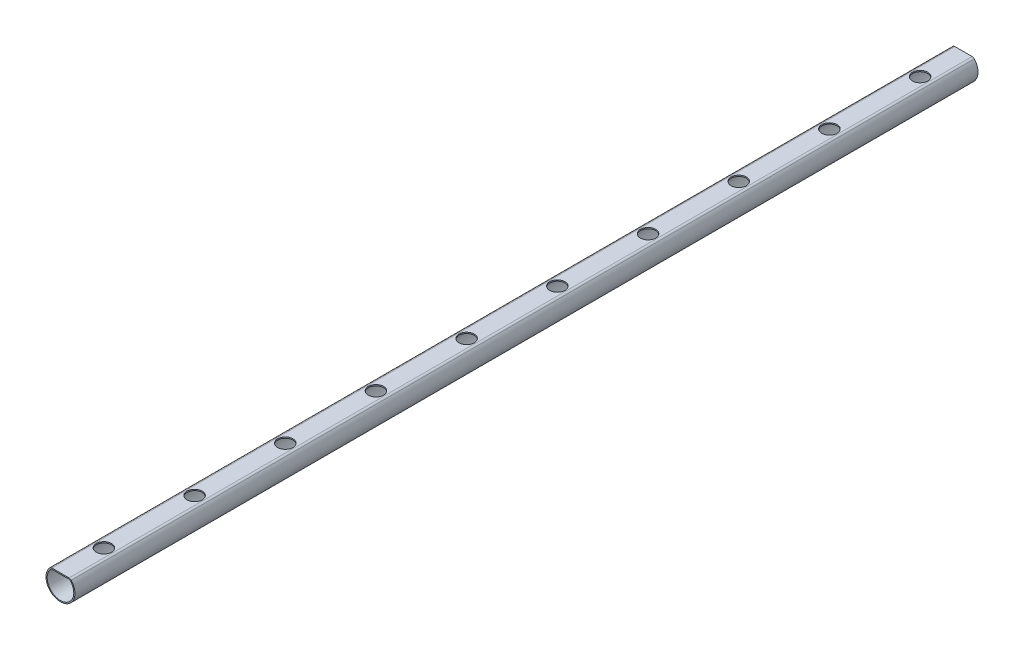
ISO-10303-21;
HEADER;
FILE_DESCRIPTION(('STEP AP214'),'2;1');
FILE_NAME('part.step','',(''),(''),'','','');
FILE_SCHEMA(('AUTOMOTIVE_DESIGN { 1 0 10303 214 1 1 1 1 }'));
ENDSEC;
DATA;
#1=APPLICATION_CONTEXT('core data for automotive mechanical design processes');
#2=APPLICATION_PROTOCOL_DEFINITION('international standard','automotive_design',2000,#1);
#3=PRODUCT_CONTEXT('',#1,'mechanical');
#4=PRODUCT('Part','Part','',(#3));
#5=PRODUCT_RELATED_PRODUCT_CATEGORY('part','',(#4));
#6=PRODUCT_DEFINITION_FORMATION('','',#4);
#7=PRODUCT_DEFINITION_CONTEXT('part definition',#1,'design');
#8=PRODUCT_DEFINITION('design','',#6,#7);
#9=PRODUCT_DEFINITION_SHAPE('','',#8);
#10=(LENGTH_UNIT() NAMED_UNIT(*) SI_UNIT(.MILLI.,.METRE.));
#11=(NAMED_UNIT(*) PLANE_ANGLE_UNIT() SI_UNIT($,.RADIAN.));
#12=(NAMED_UNIT(*) SI_UNIT($,.STERADIAN.) SOLID_ANGLE_UNIT());
#13=UNCERTAINTY_MEASURE_WITH_UNIT(LENGTH_MEASURE(1.E-05),#10,'distance_accuracy_value','');
#14=(GEOMETRIC_REPRESENTATION_CONTEXT(3) GLOBAL_UNCERTAINTY_ASSIGNED_CONTEXT((#13)) GLOBAL_UNIT_ASSIGNED_CONTEXT((#10,
#11,#12)) REPRESENTATION_CONTEXT('',''));
#15=CARTESIAN_POINT('',(0.,0.,0.));
#16=DIRECTION('',(0.,0.,1.));
#17=DIRECTION('',(1.,0.,0.));
#18=AXIS2_PLACEMENT_3D('',#15,#16,#17);
#19=CARTESIAN_POINT('',(-8.94427190999916,7.99999999999999,936.));
#20=DIRECTION('',(0.,0.,-1.));
#21=DIRECTION('',(-1.,0.,0.));
#22=AXIS2_PLACEMENT_3D('',#19,#20,#21);
#23=PLANE('',#22);
#24=CARTESIAN_POINT('',(-8.94427190999916,7.99999999999999,936.));
#25=DIRECTION('',(0.,0.,1.));
#26=DIRECTION('',(-1.,0.,0.));
#27=AXIS2_PLACEMENT_3D('',#24,#25,#26);
#28=CIRCLE('',#27,3.);
#29=CARTESIAN_POINT('',(-8.94427190999916,11.,936.));
#30=VERTEX_POINT('',#29);
#31=CARTESIAN_POINT('',(-11.180339887499,9.99999999999999,936.));
#32=VERTEX_POINT('',#31);
#33=EDGE_CURVE('E140',#30,#32,#28,.T.);
#34=ORIENTED_EDGE('',*,*,#33,.T.);
#35=CARTESIAN_POINT('',(0.,0.,936.));
#36=DIRECTION('',(0.,0.,1.));
#37=DIRECTION('',(1.,0.,0.));
#38=AXIS2_PLACEMENT_3D('',#35,#36,#37);
#39=CIRCLE('',#38,15.);
#40=CARTESIAN_POINT('',(11.1803398874989,10.,936.));
#41=VERTEX_POINT('',#40);
#42=EDGE_CURVE('E143',#32,#41,#39,.T.);
#43=ORIENTED_EDGE('',*,*,#42,.T.);
#44=CARTESIAN_POINT('',(8.94427190999916,8.,936.));
#45=DIRECTION('',(0.,0.,1.));
#46=DIRECTION('',(-1.,0.,0.));
#47=AXIS2_PLACEMENT_3D('',#44,#45,#46);
#48=CIRCLE('',#47,3.);
#49=CARTESIAN_POINT('',(8.94427190999916,11.,936.));
#50=VERTEX_POINT('',#49);
#51=EDGE_CURVE('E146',#41,#50,#48,.T.);
#52=ORIENTED_EDGE('',*,*,#51,.T.);
#53=DIRECTION('',(-1.,0.,0.));
#54=VECTOR('',#53,1.);
#55=CARTESIAN_POINT('',(8.94427190999916,11.,936.));
#56=LINE('',#55,#54);
#57=EDGE_CURVE('E148',#50,#30,#56,.T.);
#58=ORIENTED_EDGE('',*,*,#57,.T.);
#59=EDGE_LOOP('',(#34,#43,#52,#58));
#60=FACE_BOUND('',#59,.T.);
#61=CARTESIAN_POINT('',(-8.94427190999916,7.99999999999999,936.));
#62=DIRECTION('',(0.,0.,1.));
#63=DIRECTION('',(-1.,0.,0.));
#64=AXIS2_PLACEMENT_3D('',#61,#62,#63);
#65=CIRCLE('',#64,1.80000000000001);
#66=CARTESIAN_POINT('',(-8.94427190999916,9.8,936.));
#67=VERTEX_POINT('',#66);
#68=CARTESIAN_POINT('',(-10.285912696499,9.19999999999999,936.));
#69=VERTEX_POINT('',#68);
#70=EDGE_CURVE('E102',#67,#69,#65,.T.);
#71=ORIENTED_EDGE('',*,*,#70,.F.);
#72=DIRECTION('',(-1.,0.,0.));
#73=VECTOR('',#72,1.);
#74=CARTESIAN_POINT('',(8.94427190999916,9.8,936.));
#75=LINE('',#74,#73);
#76=CARTESIAN_POINT('',(8.94427190999916,9.8,936.));
#77=VERTEX_POINT('',#76);
#78=EDGE_CURVE('E124',#77,#67,#75,.T.);
#79=ORIENTED_EDGE('',*,*,#78,.F.);
#80=CARTESIAN_POINT('',(8.94427190999916,8.,936.));
#81=DIRECTION('',(0.,0.,1.));
#82=DIRECTION('',(-1.,0.,0.));
#83=AXIS2_PLACEMENT_3D('',#80,#81,#82);
#84=CIRCLE('',#83,1.8);
#85=CARTESIAN_POINT('',(10.285912696499,9.2,936.));
#86=VERTEX_POINT('',#85);
#87=EDGE_CURVE('E122',#86,#77,#84,.T.);
#88=ORIENTED_EDGE('',*,*,#87,.F.);
#89=CARTESIAN_POINT('',(0.,0.,936.));
#90=DIRECTION('',(0.,0.,1.));
#91=DIRECTION('',(1.,0.,0.));
#92=AXIS2_PLACEMENT_3D('',#89,#90,#91);
#93=CIRCLE('',#92,13.8);
#94=EDGE_CURVE('E110',#69,#86,#93,.T.);
#95=ORIENTED_EDGE('',*,*,#94,.F.);
#96=EDGE_LOOP('',(#71,#79,#88,#95));
#97=FACE_BOUND('',#96,.T.);
#98=ADVANCED_FACE('F37',(#60,#97),#23,.F.);
#99=CARTESIAN_POINT('',(-8.94427190999916,7.99999999999999,0.));
#100=DIRECTION('',(0.,0.,-1.));
#101=DIRECTION('',(-1.,0.,0.));
#102=AXIS2_PLACEMENT_3D('',#99,#100,#101);
#103=PLANE('',#102);
#104=CARTESIAN_POINT('',(-8.94427190999916,7.99999999999999,0.));
#105=DIRECTION('',(0.,0.,1.));
#106=DIRECTION('',(-1.,0.,0.));
#107=AXIS2_PLACEMENT_3D('',#104,#105,#106);
#108=CIRCLE('',#107,3.);
#109=CARTESIAN_POINT('',(-8.94427190999916,11.,0.));
#110=VERTEX_POINT('',#109);
#111=CARTESIAN_POINT('',(-11.180339887499,9.99999999999999,0.));
#112=VERTEX_POINT('',#111);
#113=EDGE_CURVE('E118',#110,#112,#108,.T.);
#114=ORIENTED_EDGE('',*,*,#113,.F.);
#115=DIRECTION('',(-1.,0.,0.));
#116=VECTOR('',#115,1.);
#117=CARTESIAN_POINT('',(8.94427190999916,11.,0.));
#118=LINE('',#117,#116);
#119=CARTESIAN_POINT('',(8.94427190999916,11.,0.));
#120=VERTEX_POINT('',#119);
#121=EDGE_CURVE('E144',#120,#110,#118,.T.);
#122=ORIENTED_EDGE('',*,*,#121,.F.);
#123=CARTESIAN_POINT('',(8.94427190999916,8.,0.));
#124=DIRECTION('',(0.,0.,1.));
#125=DIRECTION('',(-1.,0.,0.));
#126=AXIS2_PLACEMENT_3D('',#123,#124,#125);
#127=CIRCLE('',#126,3.);
#128=CARTESIAN_POINT('',(11.1803398874989,10.,0.));
#129=VERTEX_POINT('',#128);
#130=EDGE_CURVE('E155',#129,#120,#127,.T.);
#131=ORIENTED_EDGE('',*,*,#130,.F.);
#132=CARTESIAN_POINT('',(0.,0.,0.));
#133=DIRECTION('',(0.,0.,1.));
#134=DIRECTION('',(1.,0.,0.));
#135=AXIS2_PLACEMENT_3D('',#132,#133,#134);
#136=CIRCLE('',#135,15.);
#137=EDGE_CURVE('E153',#112,#129,#136,.T.);
#138=ORIENTED_EDGE('',*,*,#137,.F.);
#139=EDGE_LOOP('',(#114,#122,#131,#138));
#140=FACE_BOUND('',#139,.T.);
#141=DIRECTION('',(-1.,0.,0.));
#142=VECTOR('',#141,1.);
#143=CARTESIAN_POINT('',(8.94427190999916,9.8,0.));
#144=LINE('',#143,#142);
#145=CARTESIAN_POINT('',(8.94427190999916,9.8,0.));
#146=VERTEX_POINT('',#145);
#147=CARTESIAN_POINT('',(-8.94427190999916,9.8,0.));
#148=VERTEX_POINT('',#147);
#149=EDGE_CURVE('E111',#146,#148,#144,.T.);
#150=ORIENTED_EDGE('',*,*,#149,.T.);
#151=CARTESIAN_POINT('',(-8.94427190999916,7.99999999999999,0.));
#152=DIRECTION('',(0.,0.,1.));
#153=DIRECTION('',(-1.,0.,0.));
#154=AXIS2_PLACEMENT_3D('',#151,#152,#153);
#155=CIRCLE('',#154,1.80000000000001);
#156=CARTESIAN_POINT('',(-10.285912696499,9.19999999999999,0.));
#157=VERTEX_POINT('',#156);
#158=EDGE_CURVE('E60',#148,#157,#155,.T.);
#159=ORIENTED_EDGE('',*,*,#158,.T.);
#160=CARTESIAN_POINT('',(0.,0.,0.));
#161=DIRECTION('',(0.,0.,1.));
#162=DIRECTION('',(1.,0.,0.));
#163=AXIS2_PLACEMENT_3D('',#160,#161,#162);
#164=CIRCLE('',#163,13.8);
#165=CARTESIAN_POINT('',(10.285912696499,9.2,0.));
#166=VERTEX_POINT('',#165);
#167=EDGE_CURVE('E117',#157,#166,#164,.T.);
#168=ORIENTED_EDGE('',*,*,#167,.T.);
#169=CARTESIAN_POINT('',(8.94427190999916,8.,0.));
#170=DIRECTION('',(0.,0.,1.));
#171=DIRECTION('',(-1.,0.,0.));
#172=AXIS2_PLACEMENT_3D('',#169,#170,#171);
#173=CIRCLE('',#172,1.8);
#174=EDGE_CURVE('E132',#166,#146,#173,.T.);
#175=ORIENTED_EDGE('',*,*,#174,.T.);
#176=EDGE_LOOP('',(#150,#159,#168,#175));
#177=FACE_BOUND('',#176,.T.);
#178=ADVANCED_FACE('F173',(#140,#177),#103,.T.);
#179=CARTESIAN_POINT('',(-8.94427190999916,7.99999999999999,936.));
#180=DIRECTION('',(0.,0.,-1.));
#181=DIRECTION('',(-1.,0.,0.));
#182=AXIS2_PLACEMENT_3D('',#179,#180,#181);
#183=CYLINDRICAL_SURFACE('',#182,3.);
#184=ORIENTED_EDGE('',*,*,#113,.T.);
#185=DIRECTION('',(0.,0.,-1.));
#186=VECTOR('',#185,1.);
#187=CARTESIAN_POINT('',(-11.180339887499,9.99999999999999,936.));
#188=LINE('',#187,#186);
#189=EDGE_CURVE('E11',#32,#112,#188,.T.);
#190=ORIENTED_EDGE('',*,*,#189,.F.);
#191=ORIENTED_EDGE('',*,*,#33,.F.);
#192=DIRECTION('',(0.,0.,-1.));
#193=VECTOR('',#192,1.);
#194=CARTESIAN_POINT('',(-8.94427190999916,11.,936.));
#195=LINE('',#194,#193);
#196=EDGE_CURVE('E150',#30,#110,#195,.T.);
#197=ORIENTED_EDGE('',*,*,#196,.T.);
#198=EDGE_LOOP('',(#184,#190,#191,#197));
#199=FACE_BOUND('',#198,.T.);
#200=ADVANCED_FACE('F39',(#199),#183,.T.);
#201=CARTESIAN_POINT('',(0.,0.,936.));
#202=DIRECTION('',(0.,0.,-1.));
#203=DIRECTION('',(-1.,0.,0.));
#204=AXIS2_PLACEMENT_3D('',#201,#202,#203);
#205=CYLINDRICAL_SURFACE('',#204,15.);
#206=ORIENTED_EDGE('',*,*,#137,.T.);
#207=DIRECTION('',(0.,0.,-1.));
#208=VECTOR('',#207,1.);
#209=CARTESIAN_POINT('',(11.1803398874989,10.,936.));
#210=LINE('',#209,#208);
#211=EDGE_CURVE('E45',#41,#129,#210,.T.);
#212=ORIENTED_EDGE('',*,*,#211,.F.);
#213=ORIENTED_EDGE('',*,*,#42,.F.);
#214=ORIENTED_EDGE('',*,*,#189,.T.);
#215=EDGE_LOOP('',(#206,#212,#213,#214));
#216=FACE_BOUND('',#215,.T.);
#217=ADVANCED_FACE('F183',(#216),#205,.T.);
#218=CARTESIAN_POINT('',(8.94427190999916,8.,936.));
#219=DIRECTION('',(0.,0.,-1.));
#220=DIRECTION('',(-1.,0.,0.));
#221=AXIS2_PLACEMENT_3D('',#218,#219,#220);
#222=CYLINDRICAL_SURFACE('',#221,3.);
#223=ORIENTED_EDGE('',*,*,#130,.T.);
#224=DIRECTION('',(0.,0.,-1.));
#225=VECTOR('',#224,1.);
#226=CARTESIAN_POINT('',(8.94427190999916,11.,936.));
#227=LINE('',#226,#225);
#228=EDGE_CURVE('E160',#50,#120,#227,.T.);
#229=ORIENTED_EDGE('',*,*,#228,.F.);
#230=ORIENTED_EDGE('',*,*,#51,.F.);
#231=ORIENTED_EDGE('',*,*,#211,.T.);
#232=EDGE_LOOP('',(#223,#229,#230,#231));
#233=FACE_BOUND('',#232,.T.);
#234=ADVANCED_FACE('F167',(#233),#222,.T.);
#235=CARTESIAN_POINT('',(8.94427190999916,11.,936.));
#236=DIRECTION('',(0.,-1.,0.));
#237=DIRECTION('',(1.,0.,0.));
#238=AXIS2_PLACEMENT_3D('',#235,#236,#237);
#239=PLANE('',#238);
#240=CARTESIAN_POINT('',(-2.84894403843315E-12,11.,45.0000000000013));
#241=DIRECTION('',(0.,1.,0.));
#242=DIRECTION('',(-1.,0.,0.));
#243=AXIS2_PLACEMENT_3D('',#240,#241,#242);
#244=CIRCLE('',#243,7.9);
#245=CARTESIAN_POINT('',(-7.90000000000285,11.,45.0000000000013));
#246=VERTEX_POINT('',#245);
#247=EDGE_CURVE('E207',#246,#246,#244,.T.);
#248=ORIENTED_EDGE('',*,*,#247,.F.);
#249=EDGE_LOOP('',(#248));
#250=FACE_BOUND('',#249,.T.);
#251=CARTESIAN_POINT('',(-2.5207447925819E-12,11.,139.000000000001));
#252=DIRECTION('',(0.,1.,0.));
#253=DIRECTION('',(-1.,0.,0.));
#254=AXIS2_PLACEMENT_3D('',#251,#252,#253);
#255=CIRCLE('',#254,7.90000000000004);
#256=CARTESIAN_POINT('',(-7.90000000000256,11.,139.000000000001));
#257=VERTEX_POINT('',#256);
#258=EDGE_CURVE('E211',#257,#257,#255,.T.);
#259=ORIENTED_EDGE('',*,*,#258,.F.);
#260=EDGE_LOOP('',(#259));
#261=FACE_BOUND('',#260,.T.);
#262=CARTESIAN_POINT('',(-2.19254554673064E-12,11.,233.000000000001));
#263=DIRECTION('',(0.,1.,0.));
#264=DIRECTION('',(-1.,0.,0.));
#265=AXIS2_PLACEMENT_3D('',#262,#263,#264);
#266=CIRCLE('',#265,7.90000000000004);
#267=CARTESIAN_POINT('',(-7.90000000000223,11.,233.000000000001));
#268=VERTEX_POINT('',#267);
#269=EDGE_CURVE('E215',#268,#268,#266,.T.);
#270=ORIENTED_EDGE('',*,*,#269,.F.);
#271=EDGE_LOOP('',(#270));
#272=FACE_BOUND('',#271,.T.);
#273=CARTESIAN_POINT('',(-1.86434630087939E-12,11.,327.000000000001));
#274=DIRECTION('',(0.,1.,0.));
#275=DIRECTION('',(-1.,0.,0.));
#276=AXIS2_PLACEMENT_3D('',#273,#274,#275);
#277=CIRCLE('',#276,7.90000000000004);
#278=CARTESIAN_POINT('',(-7.9000000000019,11.,327.000000000001));
#279=VERTEX_POINT('',#278);
#280=EDGE_CURVE('E219',#279,#279,#277,.T.);
#281=ORIENTED_EDGE('',*,*,#280,.F.);
#282=EDGE_LOOP('',(#281));
#283=FACE_BOUND('',#282,.T.);
#284=CARTESIAN_POINT('',(-1.53614705502814E-12,11.,421.000000000001));
#285=DIRECTION('',(0.,1.,0.));
#286=DIRECTION('',(-1.,0.,0.));
#287=AXIS2_PLACEMENT_3D('',#284,#285,#286);
#288=CIRCLE('',#287,7.90000000000004);
#289=CARTESIAN_POINT('',(-7.90000000000157,11.,421.000000000001));
#290=VERTEX_POINT('',#289);
#291=EDGE_CURVE('E223',#290,#290,#288,.T.);
#292=ORIENTED_EDGE('',*,*,#291,.F.);
#293=EDGE_LOOP('',(#292));
#294=FACE_BOUND('',#293,.T.);
#295=CARTESIAN_POINT('',(-1.20794780917688E-12,11.,515.000000000001));
#296=DIRECTION('',(0.,1.,0.));
#297=DIRECTION('',(-1.,0.,0.));
#298=AXIS2_PLACEMENT_3D('',#295,#296,#297);
#299=CIRCLE('',#298,7.90000000000001);
#300=CARTESIAN_POINT('',(-7.90000000000122,11.,515.000000000001));
#301=VERTEX_POINT('',#300);
#302=EDGE_CURVE('E227',#301,#301,#299,.T.);
#303=ORIENTED_EDGE('',*,*,#302,.F.);
#304=EDGE_LOOP('',(#303));
#305=FACE_BOUND('',#304,.T.);
#306=CARTESIAN_POINT('',(-8.79748563325627E-13,11.,609.));
#307=DIRECTION('',(0.,1.,0.));
#308=DIRECTION('',(-1.,0.,0.));
#309=AXIS2_PLACEMENT_3D('',#306,#307,#308);
#310=CIRCLE('',#309,7.90000000000001);
#311=CARTESIAN_POINT('',(-7.90000000000089,11.,609.));
#312=VERTEX_POINT('',#311);
#313=EDGE_CURVE('E231',#312,#312,#310,.T.);
#314=ORIENTED_EDGE('',*,*,#313,.F.);
#315=EDGE_LOOP('',(#314));
#316=FACE_BOUND('',#315,.T.);
#317=CARTESIAN_POINT('',(-5.51549317474373E-13,11.,703.));
#318=DIRECTION('',(0.,1.,0.));
#319=DIRECTION('',(-1.,0.,0.));
#320=AXIS2_PLACEMENT_3D('',#317,#318,#319);
#321=CIRCLE('',#320,7.89999999999998);
#322=CARTESIAN_POINT('',(-7.90000000000054,11.,703.));
#323=VERTEX_POINT('',#322);
#324=EDGE_CURVE('E235',#323,#323,#321,.T.);
#325=ORIENTED_EDGE('',*,*,#324,.F.);
#326=EDGE_LOOP('',(#325));
#327=FACE_BOUND('',#326,.T.);
#328=CARTESIAN_POINT('',(-2.23350071623119E-13,11.,797.));
#329=DIRECTION('',(0.,1.,0.));
#330=DIRECTION('',(-1.,0.,0.));
#331=AXIS2_PLACEMENT_3D('',#328,#329,#330);
#332=CIRCLE('',#331,7.90000000000001);
#333=CARTESIAN_POINT('',(-7.90000000000023,11.,797.));
#334=VERTEX_POINT('',#333);
#335=EDGE_CURVE('E239',#334,#334,#332,.T.);
#336=ORIENTED_EDGE('',*,*,#335,.F.);
#337=EDGE_LOOP('',(#336));
#338=FACE_BOUND('',#337,.T.);
#339=CARTESIAN_POINT('',(1.04849174228135E-13,11.,891.));
#340=DIRECTION('',(0.,1.,0.));
#341=DIRECTION('',(-1.,0.,0.));
#342=AXIS2_PLACEMENT_3D('',#339,#340,#341);
#343=CIRCLE('',#342,7.90000000000001);
#344=CARTESIAN_POINT('',(-7.89999999999991,11.,891.));
#345=VERTEX_POINT('',#344);
#346=EDGE_CURVE('E130',#345,#345,#343,.T.);
#347=ORIENTED_EDGE('',*,*,#346,.F.);
#348=EDGE_LOOP('',(#347));
#349=FACE_BOUND('',#348,.T.);
#350=ORIENTED_EDGE('',*,*,#121,.T.);
#351=ORIENTED_EDGE('',*,*,#196,.F.);
#352=ORIENTED_EDGE('',*,*,#57,.F.);
#353=ORIENTED_EDGE('',*,*,#228,.T.);
#354=EDGE_LOOP('',(#350,#351,#352,#353));
#355=FACE_BOUND('',#354,.T.);
#356=ADVANCED_FACE('F177',(#250,#261,#272,#283,#294,#305,#316,#327,#338,#349,#355),#239,.F.);
#357=CARTESIAN_POINT('',(-8.94427190999916,7.99999999999999,936.));
#358=DIRECTION('',(0.,0.,-1.));
#359=DIRECTION('',(-1.,0.,0.));
#360=AXIS2_PLACEMENT_3D('',#357,#358,#359);
#361=CYLINDRICAL_SURFACE('',#360,1.80000000000001);
#362=ORIENTED_EDGE('',*,*,#158,.F.);
#363=DIRECTION('',(0.,0.,-1.));
#364=VECTOR('',#363,1.);
#365=CARTESIAN_POINT('',(-8.94427190999916,9.8,936.));
#366=LINE('',#365,#364);
#367=EDGE_CURVE('E106',#67,#148,#366,.T.);
#368=ORIENTED_EDGE('',*,*,#367,.F.);
#369=ORIENTED_EDGE('',*,*,#70,.T.);
#370=DIRECTION('',(0.,0.,-1.));
#371=VECTOR('',#370,1.);
#372=CARTESIAN_POINT('',(-10.285912696499,9.19999999999999,936.));
#373=LINE('',#372,#371);
#374=EDGE_CURVE('E105',#69,#157,#373,.T.);
#375=ORIENTED_EDGE('',*,*,#374,.T.);
#376=EDGE_LOOP('',(#362,#368,#369,#375));
#377=FACE_BOUND('',#376,.T.);
#378=ADVANCED_FACE('F104',(#377),#361,.F.);
#379=CARTESIAN_POINT('',(0.,0.,936.));
#380=DIRECTION('',(0.,0.,-1.));
#381=DIRECTION('',(-1.,0.,0.));
#382=AXIS2_PLACEMENT_3D('',#379,#380,#381);
#383=CYLINDRICAL_SURFACE('',#382,13.8);
#384=ORIENTED_EDGE('',*,*,#167,.F.);
#385=ORIENTED_EDGE('',*,*,#374,.F.);
#386=ORIENTED_EDGE('',*,*,#94,.T.);
#387=DIRECTION('',(0.,0.,-1.));
#388=VECTOR('',#387,1.);
#389=CARTESIAN_POINT('',(10.285912696499,9.2,936.));
#390=LINE('',#389,#388);
#391=EDGE_CURVE('E119',#86,#166,#390,.T.);
#392=ORIENTED_EDGE('',*,*,#391,.T.);
#393=EDGE_LOOP('',(#384,#385,#386,#392));
#394=FACE_BOUND('',#393,.T.);
#395=ADVANCED_FACE('F114',(#394),#383,.F.);
#396=CARTESIAN_POINT('',(8.94427190999916,8.,936.));
#397=DIRECTION('',(0.,0.,-1.));
#398=DIRECTION('',(-1.,0.,0.));
#399=AXIS2_PLACEMENT_3D('',#396,#397,#398);
#400=CYLINDRICAL_SURFACE('',#399,1.8);
#401=ORIENTED_EDGE('',*,*,#174,.F.);
#402=ORIENTED_EDGE('',*,*,#391,.F.);
#403=ORIENTED_EDGE('',*,*,#87,.T.);
#404=DIRECTION('',(0.,0.,-1.));
#405=VECTOR('',#404,1.);
#406=CARTESIAN_POINT('',(8.94427190999916,9.8,936.));
#407=LINE('',#406,#405);
#408=EDGE_CURVE('E52',#77,#146,#407,.T.);
#409=ORIENTED_EDGE('',*,*,#408,.T.);
#410=EDGE_LOOP('',(#401,#402,#403,#409));
#411=FACE_BOUND('',#410,.T.);
#412=ADVANCED_FACE('F330',(#411),#400,.F.);
#413=CARTESIAN_POINT('',(8.94427190999916,9.8,936.));
#414=DIRECTION('',(0.,-1.,0.));
#415=DIRECTION('',(1.,0.,0.));
#416=AXIS2_PLACEMENT_3D('',#413,#414,#415);
#417=PLANE('',#416);
#418=CARTESIAN_POINT('',(-2.84847856327942E-12,9.8,45.0000000000013));
#419=DIRECTION('',(0.,-1.,0.));
#420=DIRECTION('',(1.,0.,0.));
#421=AXIS2_PLACEMENT_3D('',#418,#419,#420);
#422=CIRCLE('',#421,7.9);
#423=CARTESIAN_POINT('',(7.89999999999715,9.8,45.0000000000013));
#424=VERTEX_POINT('',#423);
#425=EDGE_CURVE('E279',#424,#424,#422,.F.);
#426=ORIENTED_EDGE('',*,*,#425,.T.);
#427=EDGE_LOOP('',(#426));
#428=FACE_BOUND('',#427,.T.);
#429=CARTESIAN_POINT('',(-2.52027931742816E-12,9.8,139.000000000001));
#430=DIRECTION('',(0.,-1.,0.));
#431=DIRECTION('',(1.,0.,0.));
#432=AXIS2_PLACEMENT_3D('',#429,#430,#431);
#433=CIRCLE('',#432,7.90000000000004);
#434=CARTESIAN_POINT('',(7.89999999999752,9.8,139.000000000001));
#435=VERTEX_POINT('',#434);
#436=EDGE_CURVE('E275',#435,#435,#433,.F.);
#437=ORIENTED_EDGE('',*,*,#436,.T.);
#438=EDGE_LOOP('',(#437));
#439=FACE_BOUND('',#438,.T.);
#440=CARTESIAN_POINT('',(-2.19208007157691E-12,9.8,233.000000000001));
#441=DIRECTION('',(0.,-1.,0.));
#442=DIRECTION('',(1.,0.,0.));
#443=AXIS2_PLACEMENT_3D('',#440,#441,#442);
#444=CIRCLE('',#443,7.90000000000004);
#445=CARTESIAN_POINT('',(7.89999999999784,9.8,233.000000000001));
#446=VERTEX_POINT('',#445);
#447=EDGE_CURVE('E271',#446,#446,#444,.F.);
#448=ORIENTED_EDGE('',*,*,#447,.T.);
#449=EDGE_LOOP('',(#448));
#450=FACE_BOUND('',#449,.T.);
#451=CARTESIAN_POINT('',(-1.86388082572566E-12,9.8,327.000000000001));
#452=DIRECTION('',(0.,-1.,0.));
#453=DIRECTION('',(1.,0.,0.));
#454=AXIS2_PLACEMENT_3D('',#451,#452,#453);
#455=CIRCLE('',#454,7.90000000000004);
#456=CARTESIAN_POINT('',(7.89999999999817,9.8,327.000000000001));
#457=VERTEX_POINT('',#456);
#458=EDGE_CURVE('E267',#457,#457,#455,.F.);
#459=ORIENTED_EDGE('',*,*,#458,.T.);
#460=EDGE_LOOP('',(#459));
#461=FACE_BOUND('',#460,.T.);
#462=CARTESIAN_POINT('',(-1.5356815798744E-12,9.8,421.000000000001));
#463=DIRECTION('',(0.,-1.,0.));
#464=DIRECTION('',(1.,0.,0.));
#465=AXIS2_PLACEMENT_3D('',#462,#463,#464);
#466=CIRCLE('',#465,7.90000000000004);
#467=CARTESIAN_POINT('',(7.8999999999985,9.8,421.000000000001));
#468=VERTEX_POINT('',#467);
#469=EDGE_CURVE('E263',#468,#468,#466,.F.);
#470=ORIENTED_EDGE('',*,*,#469,.T.);
#471=EDGE_LOOP('',(#470));
#472=FACE_BOUND('',#471,.T.);
#473=CARTESIAN_POINT('',(-1.20748233402315E-12,9.8,515.000000000001));
#474=DIRECTION('',(0.,-1.,0.));
#475=DIRECTION('',(1.,0.,0.));
#476=AXIS2_PLACEMENT_3D('',#473,#474,#475);
#477=CIRCLE('',#476,7.90000000000001);
#478=CARTESIAN_POINT('',(7.8999999999988,9.8,515.000000000001));
#479=VERTEX_POINT('',#478);
#480=EDGE_CURVE('E259',#479,#479,#477,.F.);
#481=ORIENTED_EDGE('',*,*,#480,.T.);
#482=EDGE_LOOP('',(#481));
#483=FACE_BOUND('',#482,.T.);
#484=CARTESIAN_POINT('',(-8.79283088171893E-13,9.8,609.));
#485=DIRECTION('',(0.,-1.,0.));
#486=DIRECTION('',(1.,0.,0.));
#487=AXIS2_PLACEMENT_3D('',#484,#485,#486);
#488=CIRCLE('',#487,7.90000000000001);
#489=CARTESIAN_POINT('',(7.89999999999913,9.8,609.));
#490=VERTEX_POINT('',#489);
#491=EDGE_CURVE('E255',#490,#490,#488,.F.);
#492=ORIENTED_EDGE('',*,*,#491,.T.);
#493=EDGE_LOOP('',(#492));
#494=FACE_BOUND('',#493,.T.);
#495=CARTESIAN_POINT('',(-5.51083842320639E-13,9.8,703.));
#496=DIRECTION('',(0.,-1.,0.));
#497=DIRECTION('',(1.,0.,0.));
#498=AXIS2_PLACEMENT_3D('',#495,#496,#497);
#499=CIRCLE('',#498,7.89999999999998);
#500=CARTESIAN_POINT('',(7.89999999999943,9.8,703.));
#501=VERTEX_POINT('',#500);
#502=EDGE_CURVE('E251',#501,#501,#499,.F.);
#503=ORIENTED_EDGE('',*,*,#502,.T.);
#504=EDGE_LOOP('',(#503));
#505=FACE_BOUND('',#504,.T.);
#506=CARTESIAN_POINT('',(-2.22884596469385E-13,9.8,797.));
#507=DIRECTION('',(0.,-1.,0.));
#508=DIRECTION('',(1.,0.,0.));
#509=AXIS2_PLACEMENT_3D('',#506,#507,#508);
#510=CIRCLE('',#509,7.90000000000001);
#511=CARTESIAN_POINT('',(7.89999999999979,9.8,797.));
#512=VERTEX_POINT('',#511);
#513=EDGE_CURVE('E247',#512,#512,#510,.F.);
#514=ORIENTED_EDGE('',*,*,#513,.T.);
#515=EDGE_LOOP('',(#514));
#516=FACE_BOUND('',#515,.T.);
#517=CARTESIAN_POINT('',(1.05314649381869E-13,9.8,891.));
#518=DIRECTION('',(0.,-1.,0.));
#519=DIRECTION('',(1.,0.,0.));
#520=AXIS2_PLACEMENT_3D('',#517,#518,#519);
#521=CIRCLE('',#520,7.90000000000001);
#522=CARTESIAN_POINT('',(7.90000000000011,9.8,891.));
#523=VERTEX_POINT('',#522);
#524=EDGE_CURVE('E243',#523,#523,#521,.F.);
#525=ORIENTED_EDGE('',*,*,#524,.T.);
#526=EDGE_LOOP('',(#525));
#527=FACE_BOUND('',#526,.T.);
#528=ORIENTED_EDGE('',*,*,#149,.F.);
#529=ORIENTED_EDGE('',*,*,#408,.F.);
#530=ORIENTED_EDGE('',*,*,#78,.T.);
#531=ORIENTED_EDGE('',*,*,#367,.T.);
#532=EDGE_LOOP('',(#528,#529,#530,#531));
#533=FACE_BOUND('',#532,.T.);
#534=ADVANCED_FACE('F326',(#428,#439,#450,#461,#472,#483,#494,#505,#516,#527,#533),#417,.T.);
#535=CARTESIAN_POINT('',(1.14934857121664E-13,-15.001,891.));
#536=DIRECTION('',(0.,1.,0.));
#537=DIRECTION('',(-1.,0.,0.));
#538=AXIS2_PLACEMENT_3D('',#535,#536,#537);
#539=CYLINDRICAL_SURFACE('',#538,7.90000000000001);
#540=ORIENTED_EDGE('',*,*,#524,.F.);
#541=EDGE_LOOP('',(#540));
#542=FACE_BOUND('',#541,.T.);
#543=ORIENTED_EDGE('',*,*,#346,.T.);
#544=EDGE_LOOP('',(#543));
#545=FACE_BOUND('',#544,.T.);
#546=ADVANCED_FACE('F322',(#542,#545),#539,.F.);
#547=CARTESIAN_POINT('',(-2.1326438872959E-13,-15.001,797.));
#548=DIRECTION('',(0.,1.,0.));
#549=DIRECTION('',(-1.,0.,0.));
#550=AXIS2_PLACEMENT_3D('',#547,#548,#549);
#551=CYLINDRICAL_SURFACE('',#550,7.90000000000001);
#552=ORIENTED_EDGE('',*,*,#513,.F.);
#553=EDGE_LOOP('',(#552));
#554=FACE_BOUND('',#553,.T.);
#555=ORIENTED_EDGE('',*,*,#335,.T.);
#556=EDGE_LOOP('',(#555));
#557=FACE_BOUND('',#556,.T.);
#558=ADVANCED_FACE('F318',(#554,#557),#551,.F.);
#559=CARTESIAN_POINT('',(-5.41463634580844E-13,-15.001,703.));
#560=DIRECTION('',(0.,1.,0.));
#561=DIRECTION('',(-1.,0.,0.));
#562=AXIS2_PLACEMENT_3D('',#559,#560,#561);
#563=CYLINDRICAL_SURFACE('',#562,7.89999999999998);
#564=ORIENTED_EDGE('',*,*,#502,.F.);
#565=EDGE_LOOP('',(#564));
#566=FACE_BOUND('',#565,.T.);
#567=ORIENTED_EDGE('',*,*,#324,.T.);
#568=EDGE_LOOP('',(#567));
#569=FACE_BOUND('',#568,.T.);
#570=ADVANCED_FACE('F314',(#566,#569),#563,.F.);
#571=CARTESIAN_POINT('',(-8.69662880432098E-13,-15.001,609.));
#572=DIRECTION('',(0.,1.,0.));
#573=DIRECTION('',(-1.,0.,0.));
#574=AXIS2_PLACEMENT_3D('',#571,#572,#573);
#575=CYLINDRICAL_SURFACE('',#574,7.90000000000001);
#576=ORIENTED_EDGE('',*,*,#491,.F.);
#577=EDGE_LOOP('',(#576));
#578=FACE_BOUND('',#577,.T.);
#579=ORIENTED_EDGE('',*,*,#313,.T.);
#580=EDGE_LOOP('',(#579));
#581=FACE_BOUND('',#580,.T.);
#582=ADVANCED_FACE('F310',(#578,#581),#575,.F.);
#583=CARTESIAN_POINT('',(-1.19786212628335E-12,-15.001,515.000000000001));
#584=DIRECTION('',(0.,1.,0.));
#585=DIRECTION('',(-1.,0.,0.));
#586=AXIS2_PLACEMENT_3D('',#583,#584,#585);
#587=CYLINDRICAL_SURFACE('',#586,7.90000000000001);
#588=ORIENTED_EDGE('',*,*,#480,.F.);
#589=EDGE_LOOP('',(#588));
#590=FACE_BOUND('',#589,.T.);
#591=ORIENTED_EDGE('',*,*,#302,.T.);
#592=EDGE_LOOP('',(#591));
#593=FACE_BOUND('',#592,.T.);
#594=ADVANCED_FACE('F306',(#590,#593),#587,.F.);
#595=CARTESIAN_POINT('',(-1.52606137213461E-12,-15.001,421.000000000001));
#596=DIRECTION('',(0.,1.,0.));
#597=DIRECTION('',(-1.,0.,0.));
#598=AXIS2_PLACEMENT_3D('',#595,#596,#597);
#599=CYLINDRICAL_SURFACE('',#598,7.90000000000004);
#600=ORIENTED_EDGE('',*,*,#469,.F.);
#601=EDGE_LOOP('',(#600));
#602=FACE_BOUND('',#601,.T.);
#603=ORIENTED_EDGE('',*,*,#291,.T.);
#604=EDGE_LOOP('',(#603));
#605=FACE_BOUND('',#604,.T.);
#606=ADVANCED_FACE('F302',(#602,#605),#599,.F.);
#607=CARTESIAN_POINT('',(-1.85426061798586E-12,-15.001,327.000000000001));
#608=DIRECTION('',(0.,1.,0.));
#609=DIRECTION('',(-1.,0.,0.));
#610=AXIS2_PLACEMENT_3D('',#607,#608,#609);
#611=CYLINDRICAL_SURFACE('',#610,7.90000000000004);
#612=ORIENTED_EDGE('',*,*,#458,.F.);
#613=EDGE_LOOP('',(#612));
#614=FACE_BOUND('',#613,.T.);
#615=ORIENTED_EDGE('',*,*,#280,.T.);
#616=EDGE_LOOP('',(#615));
#617=FACE_BOUND('',#616,.T.);
#618=ADVANCED_FACE('F298',(#614,#617),#611,.F.);
#619=CARTESIAN_POINT('',(-2.18245986383711E-12,-15.001,233.000000000001));
#620=DIRECTION('',(0.,1.,0.));
#621=DIRECTION('',(-1.,0.,0.));
#622=AXIS2_PLACEMENT_3D('',#619,#620,#621);
#623=CYLINDRICAL_SURFACE('',#622,7.90000000000004);
#624=ORIENTED_EDGE('',*,*,#447,.F.);
#625=EDGE_LOOP('',(#624));
#626=FACE_BOUND('',#625,.T.);
#627=ORIENTED_EDGE('',*,*,#269,.T.);
#628=EDGE_LOOP('',(#627));
#629=FACE_BOUND('',#628,.T.);
#630=ADVANCED_FACE('F291',(#626,#629),#623,.F.);
#631=CARTESIAN_POINT('',(-2.51065910968837E-12,-15.001,139.000000000001));
#632=DIRECTION('',(0.,1.,0.));
#633=DIRECTION('',(-1.,0.,0.));
#634=AXIS2_PLACEMENT_3D('',#631,#632,#633);
#635=CYLINDRICAL_SURFACE('',#634,7.90000000000004);
#636=ORIENTED_EDGE('',*,*,#436,.F.);
#637=EDGE_LOOP('',(#636));
#638=FACE_BOUND('',#637,.T.);
#639=ORIENTED_EDGE('',*,*,#258,.T.);
#640=EDGE_LOOP('',(#639));
#641=FACE_BOUND('',#640,.T.);
#642=ADVANCED_FACE('F285',(#638,#641),#635,.F.);
#643=CARTESIAN_POINT('',(-2.83885835553962E-12,-15.001,45.0000000000013));
#644=DIRECTION('',(0.,1.,0.));
#645=DIRECTION('',(-1.,0.,0.));
#646=AXIS2_PLACEMENT_3D('',#643,#644,#645);
#647=CYLINDRICAL_SURFACE('',#646,7.9);
#648=ORIENTED_EDGE('',*,*,#425,.F.);
#649=EDGE_LOOP('',(#648));
#650=FACE_BOUND('',#649,.T.);
#651=ORIENTED_EDGE('',*,*,#247,.T.);
#652=EDGE_LOOP('',(#651));
#653=FACE_BOUND('',#652,.T.);
#654=ADVANCED_FACE('F283',(#650,#653),#647,.F.);
#655=CLOSED_SHELL('',(#98,#178,#200,#217,#234,#356,#378,#395,#412,#534,#546,#558,#570,#582,#594,
#606,#618,#630,#642,#654));
#656=MANIFOLD_SOLID_BREP('B2',#655);
#657=ADVANCED_BREP_SHAPE_REPRESENTATION('',(#18,#656),#14);
#658=SHAPE_DEFINITION_REPRESENTATION(#9,#657);
ENDSEC;
END-ISO-10303-21;
